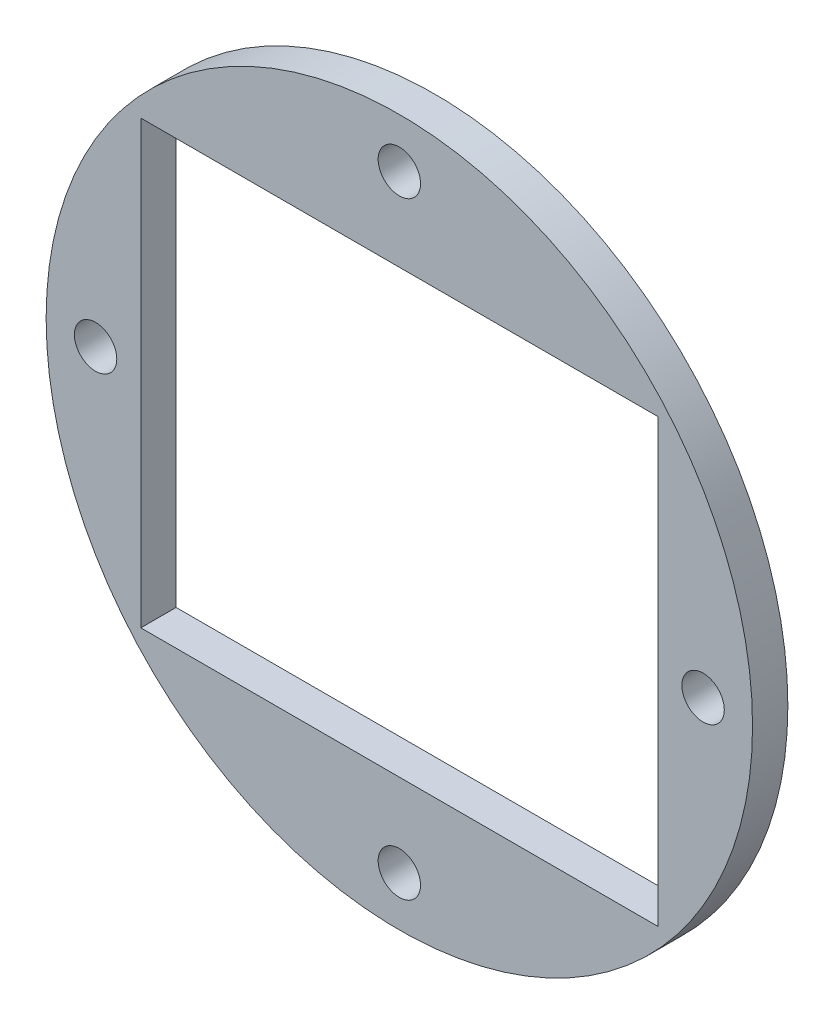
ISO-10303-21;
HEADER;
FILE_DESCRIPTION(('STEP AP214'),'2;1');
FILE_NAME('part.step','',(''),(''),'','','');
FILE_SCHEMA(('AUTOMOTIVE_DESIGN { 1 0 10303 214 1 1 1 1 }'));
ENDSEC;
DATA;
#1=APPLICATION_CONTEXT('core data for automotive mechanical design processes');
#2=APPLICATION_PROTOCOL_DEFINITION('international standard','automotive_design',2000,#1);
#3=PRODUCT_CONTEXT('',#1,'mechanical');
#4=PRODUCT('Part','Part','',(#3));
#5=PRODUCT_RELATED_PRODUCT_CATEGORY('part','',(#4));
#6=PRODUCT_DEFINITION_FORMATION('','',#4);
#7=PRODUCT_DEFINITION_CONTEXT('part definition',#1,'design');
#8=PRODUCT_DEFINITION('design','',#6,#7);
#9=PRODUCT_DEFINITION_SHAPE('','',#8);
#10=(LENGTH_UNIT() NAMED_UNIT(*) SI_UNIT(.MILLI.,.METRE.));
#11=(NAMED_UNIT(*) PLANE_ANGLE_UNIT() SI_UNIT($,.RADIAN.));
#12=(NAMED_UNIT(*) SI_UNIT($,.STERADIAN.) SOLID_ANGLE_UNIT());
#13=UNCERTAINTY_MEASURE_WITH_UNIT(LENGTH_MEASURE(1.E-05),#10,'distance_accuracy_value','');
#14=(GEOMETRIC_REPRESENTATION_CONTEXT(3) GLOBAL_UNCERTAINTY_ASSIGNED_CONTEXT((#13)) GLOBAL_UNIT_ASSIGNED_CONTEXT((#10,
#11,#12)) REPRESENTATION_CONTEXT('',''));
#15=CARTESIAN_POINT('',(0.,0.,0.));
#16=DIRECTION('',(0.,0.,1.));
#17=DIRECTION('',(1.,0.,0.));
#18=AXIS2_PLACEMENT_3D('',#15,#16,#17);
#19=CARTESIAN_POINT('',(0.,0.,5.));
#20=DIRECTION('',(0.,0.,1.));
#21=DIRECTION('',(1.,0.,0.));
#22=AXIS2_PLACEMENT_3D('',#19,#20,#21);
#23=PLANE('',#22);
#24=CARTESIAN_POINT('',(-43.,0.,5.));
#25=DIRECTION('',(0.,0.,1.));
#26=DIRECTION('',(1.,0.,0.));
#27=AXIS2_PLACEMENT_3D('',#24,#25,#26);
#28=CIRCLE('',#27,3.);
#29=CARTESIAN_POINT('',(-40.,0.,5.));
#30=VERTEX_POINT('',#29);
#31=EDGE_CURVE('E206',#30,#30,#28,.T.);
#32=ORIENTED_EDGE('',*,*,#31,.F.);
#33=EDGE_LOOP('',(#32));
#34=FACE_BOUND('',#33,.T.);
#35=CARTESIAN_POINT('',(43.,0.,5.));
#36=DIRECTION('',(0.,0.,1.));
#37=DIRECTION('',(1.,0.,0.));
#38=AXIS2_PLACEMENT_3D('',#35,#36,#37);
#39=CIRCLE('',#38,3.);
#40=CARTESIAN_POINT('',(46.,0.,5.));
#41=VERTEX_POINT('',#40);
#42=EDGE_CURVE('E102',#41,#41,#39,.T.);
#43=ORIENTED_EDGE('',*,*,#42,.F.);
#44=EDGE_LOOP('',(#43));
#45=FACE_BOUND('',#44,.T.);
#46=CARTESIAN_POINT('',(0.,0.,5.));
#47=DIRECTION('',(0.,0.,1.));
#48=DIRECTION('',(1.,0.,0.));
#49=AXIS2_PLACEMENT_3D('',#46,#47,#48);
#50=CIRCLE('',#49,50.);
#51=CARTESIAN_POINT('',(50.,0.,5.));
#52=VERTEX_POINT('',#51);
#53=EDGE_CURVE('E11',#52,#52,#50,.T.);
#54=ORIENTED_EDGE('',*,*,#53,.T.);
#55=EDGE_LOOP('',(#54));
#56=FACE_BOUND('',#55,.T.);
#57=DIRECTION('',(1.,0.,0.));
#58=VECTOR('',#57,1.);
#59=CARTESIAN_POINT('',(-36.6,-31.25,5.));
#60=LINE('',#59,#58);
#61=CARTESIAN_POINT('',(-36.6,-31.25,5.));
#62=VERTEX_POINT('',#61);
#63=CARTESIAN_POINT('',(36.6,-31.25,5.));
#64=VERTEX_POINT('',#63);
#65=EDGE_CURVE('E82',#62,#64,#60,.T.);
#66=ORIENTED_EDGE('',*,*,#65,.F.);
#67=DIRECTION('',(0.,-1.,0.));
#68=VECTOR('',#67,1.);
#69=CARTESIAN_POINT('',(-36.6,31.25,5.));
#70=LINE('',#69,#68);
#71=CARTESIAN_POINT('',(-36.6,31.25,5.));
#72=VERTEX_POINT('',#71);
#73=EDGE_CURVE('E74',#72,#62,#70,.T.);
#74=ORIENTED_EDGE('',*,*,#73,.F.);
#75=DIRECTION('',(-1.,0.,0.));
#76=VECTOR('',#75,1.);
#77=CARTESIAN_POINT('',(-36.6,31.25,5.));
#78=LINE('',#77,#76);
#79=CARTESIAN_POINT('',(36.6,31.25,5.));
#80=VERTEX_POINT('',#79);
#81=EDGE_CURVE('E96',#80,#72,#78,.T.);
#82=ORIENTED_EDGE('',*,*,#81,.F.);
#83=DIRECTION('',(0.,1.,0.));
#84=VECTOR('',#83,1.);
#85=CARTESIAN_POINT('',(36.6,31.25,5.));
#86=LINE('',#85,#84);
#87=EDGE_CURVE('E94',#64,#80,#86,.T.);
#88=ORIENTED_EDGE('',*,*,#87,.F.);
#89=EDGE_LOOP('',(#66,#74,#82,#88));
#90=FACE_BOUND('',#89,.T.);
#91=CARTESIAN_POINT('',(0.,43.,5.));
#92=DIRECTION('',(0.,0.,1.));
#93=DIRECTION('',(1.,0.,0.));
#94=AXIS2_PLACEMENT_3D('',#91,#92,#93);
#95=CIRCLE('',#94,3.);
#96=CARTESIAN_POINT('',(3.00000000000001,43.,5.));
#97=VERTEX_POINT('',#96);
#98=EDGE_CURVE('E212',#97,#97,#95,.T.);
#99=ORIENTED_EDGE('',*,*,#98,.F.);
#100=EDGE_LOOP('',(#99));
#101=FACE_BOUND('',#100,.T.);
#102=CARTESIAN_POINT('',(0.,-43.,5.));
#103=DIRECTION('',(0.,0.,1.));
#104=DIRECTION('',(1.,0.,0.));
#105=AXIS2_PLACEMENT_3D('',#102,#103,#104);
#106=CIRCLE('',#105,3.);
#107=CARTESIAN_POINT('',(3.00000000000001,-43.,5.));
#108=VERTEX_POINT('',#107);
#109=EDGE_CURVE('E197',#108,#108,#106,.T.);
#110=ORIENTED_EDGE('',*,*,#109,.F.);
#111=EDGE_LOOP('',(#110));
#112=FACE_BOUND('',#111,.T.);
#113=ADVANCED_FACE('F33',(#34,#45,#56,#90,#101,#112),#23,.T.);
#114=CARTESIAN_POINT('',(0.,0.,0.));
#115=DIRECTION('',(0.,0.,1.));
#116=DIRECTION('',(1.,0.,0.));
#117=AXIS2_PLACEMENT_3D('',#114,#115,#116);
#118=PLANE('',#117);
#119=CARTESIAN_POINT('',(0.,0.,0.));
#120=DIRECTION('',(0.,0.,1.));
#121=DIRECTION('',(1.,0.,0.));
#122=AXIS2_PLACEMENT_3D('',#119,#120,#121);
#123=CIRCLE('',#122,50.);
#124=CARTESIAN_POINT('',(50.,0.,0.));
#125=VERTEX_POINT('',#124);
#126=EDGE_CURVE('E37',#125,#125,#123,.T.);
#127=ORIENTED_EDGE('',*,*,#126,.F.);
#128=EDGE_LOOP('',(#127));
#129=FACE_BOUND('',#128,.T.);
#130=DIRECTION('',(0.,-1.,0.));
#131=VECTOR('',#130,1.);
#132=CARTESIAN_POINT('',(-36.6,31.25,0.));
#133=LINE('',#132,#131);
#134=CARTESIAN_POINT('',(-36.6,31.25,0.));
#135=VERTEX_POINT('',#134);
#136=CARTESIAN_POINT('',(-36.6,-31.25,0.));
#137=VERTEX_POINT('',#136);
#138=EDGE_CURVE('E56',#135,#137,#133,.T.);
#139=ORIENTED_EDGE('',*,*,#138,.T.);
#140=DIRECTION('',(1.,0.,0.));
#141=VECTOR('',#140,1.);
#142=CARTESIAN_POINT('',(-36.6,-31.25,0.));
#143=LINE('',#142,#141);
#144=CARTESIAN_POINT('',(36.6,-31.25,0.));
#145=VERTEX_POINT('',#144);
#146=EDGE_CURVE('E89',#137,#145,#143,.T.);
#147=ORIENTED_EDGE('',*,*,#146,.T.);
#148=DIRECTION('',(0.,1.,0.));
#149=VECTOR('',#148,1.);
#150=CARTESIAN_POINT('',(36.6,31.25,0.));
#151=LINE('',#150,#149);
#152=CARTESIAN_POINT('',(36.6,31.25,0.));
#153=VERTEX_POINT('',#152);
#154=EDGE_CURVE('E104',#145,#153,#151,.T.);
#155=ORIENTED_EDGE('',*,*,#154,.T.);
#156=DIRECTION('',(-1.,0.,0.));
#157=VECTOR('',#156,1.);
#158=CARTESIAN_POINT('',(-36.6,31.25,0.));
#159=LINE('',#158,#157);
#160=EDGE_CURVE('E83',#153,#135,#159,.T.);
#161=ORIENTED_EDGE('',*,*,#160,.T.);
#162=EDGE_LOOP('',(#139,#147,#155,#161));
#163=FACE_BOUND('',#162,.T.);
#164=CARTESIAN_POINT('',(43.,0.,0.));
#165=DIRECTION('',(0.,0.,1.));
#166=DIRECTION('',(1.,0.,0.));
#167=AXIS2_PLACEMENT_3D('',#164,#165,#166);
#168=CIRCLE('',#167,3.);
#169=CARTESIAN_POINT('',(46.,0.,0.));
#170=VERTEX_POINT('',#169);
#171=EDGE_CURVE('E215',#170,#170,#168,.T.);
#172=ORIENTED_EDGE('',*,*,#171,.T.);
#173=EDGE_LOOP('',(#172));
#174=FACE_BOUND('',#173,.T.);
#175=CARTESIAN_POINT('',(0.,43.,0.));
#176=DIRECTION('',(0.,0.,1.));
#177=DIRECTION('',(1.,0.,0.));
#178=AXIS2_PLACEMENT_3D('',#175,#176,#177);
#179=CIRCLE('',#178,3.);
#180=CARTESIAN_POINT('',(3.00000000000001,43.,0.));
#181=VERTEX_POINT('',#180);
#182=EDGE_CURVE('E209',#181,#181,#179,.T.);
#183=ORIENTED_EDGE('',*,*,#182,.T.);
#184=EDGE_LOOP('',(#183));
#185=FACE_BOUND('',#184,.T.);
#186=CARTESIAN_POINT('',(-43.,0.,0.));
#187=DIRECTION('',(0.,0.,1.));
#188=DIRECTION('',(1.,0.,0.));
#189=AXIS2_PLACEMENT_3D('',#186,#187,#188);
#190=CIRCLE('',#189,3.);
#191=CARTESIAN_POINT('',(-40.,0.,0.));
#192=VERTEX_POINT('',#191);
#193=EDGE_CURVE('E203',#192,#192,#190,.T.);
#194=ORIENTED_EDGE('',*,*,#193,.T.);
#195=EDGE_LOOP('',(#194));
#196=FACE_BOUND('',#195,.T.);
#197=CARTESIAN_POINT('',(0.,-43.,0.));
#198=DIRECTION('',(0.,0.,1.));
#199=DIRECTION('',(1.,0.,0.));
#200=AXIS2_PLACEMENT_3D('',#197,#198,#199);
#201=CIRCLE('',#200,3.);
#202=CARTESIAN_POINT('',(3.00000000000001,-43.,0.));
#203=VERTEX_POINT('',#202);
#204=EDGE_CURVE('E200',#203,#203,#201,.T.);
#205=ORIENTED_EDGE('',*,*,#204,.T.);
#206=EDGE_LOOP('',(#205));
#207=FACE_BOUND('',#206,.T.);
#208=ADVANCED_FACE('F115',(#129,#163,#174,#185,#196,#207),#118,.F.);
#209=CARTESIAN_POINT('',(0.,0.,5.));
#210=DIRECTION('',(0.,0.,-1.));
#211=DIRECTION('',(-1.,0.,0.));
#212=AXIS2_PLACEMENT_3D('',#209,#210,#211);
#213=CYLINDRICAL_SURFACE('',#212,50.);
#214=ORIENTED_EDGE('',*,*,#53,.F.);
#215=EDGE_LOOP('',(#214));
#216=FACE_BOUND('',#215,.T.);
#217=ORIENTED_EDGE('',*,*,#126,.T.);
#218=EDGE_LOOP('',(#217));
#219=FACE_BOUND('',#218,.T.);
#220=ADVANCED_FACE('F35',(#216,#219),#213,.T.);
#221=CARTESIAN_POINT('',(-36.6,31.25,5.));
#222=DIRECTION('',(1.,0.,0.));
#223=DIRECTION('',(0.,0.,-1.));
#224=AXIS2_PLACEMENT_3D('',#221,#222,#223);
#225=PLANE('',#224);
#226=ORIENTED_EDGE('',*,*,#138,.F.);
#227=DIRECTION('',(0.,0.,-1.));
#228=VECTOR('',#227,1.);
#229=CARTESIAN_POINT('',(-36.6,31.25,5.));
#230=LINE('',#229,#228);
#231=EDGE_CURVE('E78',#72,#135,#230,.T.);
#232=ORIENTED_EDGE('',*,*,#231,.F.);
#233=ORIENTED_EDGE('',*,*,#73,.T.);
#234=DIRECTION('',(0.,0.,-1.));
#235=VECTOR('',#234,1.);
#236=CARTESIAN_POINT('',(-36.6,-31.25,5.));
#237=LINE('',#236,#235);
#238=EDGE_CURVE('E77',#62,#137,#237,.T.);
#239=ORIENTED_EDGE('',*,*,#238,.T.);
#240=EDGE_LOOP('',(#226,#232,#233,#239));
#241=FACE_BOUND('',#240,.T.);
#242=ADVANCED_FACE('F76',(#241),#225,.T.);
#243=CARTESIAN_POINT('',(-36.6,-31.25,5.));
#244=DIRECTION('',(0.,1.,0.));
#245=DIRECTION('',(0.,0.,1.));
#246=AXIS2_PLACEMENT_3D('',#243,#244,#245);
#247=PLANE('',#246);
#248=ORIENTED_EDGE('',*,*,#146,.F.);
#249=ORIENTED_EDGE('',*,*,#238,.F.);
#250=ORIENTED_EDGE('',*,*,#65,.T.);
#251=DIRECTION('',(0.,0.,-1.));
#252=VECTOR('',#251,1.);
#253=CARTESIAN_POINT('',(36.6,-31.25,5.));
#254=LINE('',#253,#252);
#255=EDGE_CURVE('E90',#64,#145,#254,.T.);
#256=ORIENTED_EDGE('',*,*,#255,.T.);
#257=EDGE_LOOP('',(#248,#249,#250,#256));
#258=FACE_BOUND('',#257,.T.);
#259=ADVANCED_FACE('F86',(#258),#247,.T.);
#260=CARTESIAN_POINT('',(36.6,31.25,5.));
#261=DIRECTION('',(-1.,0.,0.));
#262=DIRECTION('',(0.,-1.,0.));
#263=AXIS2_PLACEMENT_3D('',#260,#261,#262);
#264=PLANE('',#263);
#265=ORIENTED_EDGE('',*,*,#154,.F.);
#266=ORIENTED_EDGE('',*,*,#255,.F.);
#267=ORIENTED_EDGE('',*,*,#87,.T.);
#268=DIRECTION('',(0.,0.,-1.));
#269=VECTOR('',#268,1.);
#270=CARTESIAN_POINT('',(36.6,31.25,5.));
#271=LINE('',#270,#269);
#272=EDGE_CURVE('E48',#80,#153,#271,.T.);
#273=ORIENTED_EDGE('',*,*,#272,.T.);
#274=EDGE_LOOP('',(#265,#266,#267,#273));
#275=FACE_BOUND('',#274,.T.);
#276=ADVANCED_FACE('F113',(#275),#264,.T.);
#277=CARTESIAN_POINT('',(-36.6,31.25,5.));
#278=DIRECTION('',(0.,-1.,0.));
#279=DIRECTION('',(0.,0.,-1.));
#280=AXIS2_PLACEMENT_3D('',#277,#278,#279);
#281=PLANE('',#280);
#282=ORIENTED_EDGE('',*,*,#160,.F.);
#283=ORIENTED_EDGE('',*,*,#272,.F.);
#284=ORIENTED_EDGE('',*,*,#81,.T.);
#285=ORIENTED_EDGE('',*,*,#231,.T.);
#286=EDGE_LOOP('',(#282,#283,#284,#285));
#287=FACE_BOUND('',#286,.T.);
#288=ADVANCED_FACE('F117',(#287),#281,.T.);
#289=CARTESIAN_POINT('',(43.,0.,5.));
#290=DIRECTION('',(0.,0.,-1.));
#291=DIRECTION('',(-1.,0.,0.));
#292=AXIS2_PLACEMENT_3D('',#289,#290,#291);
#293=CYLINDRICAL_SURFACE('',#292,3.);
#294=ORIENTED_EDGE('',*,*,#42,.T.);
#295=EDGE_LOOP('',(#294));
#296=FACE_BOUND('',#295,.T.);
#297=ORIENTED_EDGE('',*,*,#171,.F.);
#298=EDGE_LOOP('',(#297));
#299=FACE_BOUND('',#298,.T.);
#300=ADVANCED_FACE('F119',(#296,#299),#293,.F.);
#301=CARTESIAN_POINT('',(0.,43.,5.));
#302=DIRECTION('',(0.,0.,-1.));
#303=DIRECTION('',(-1.,0.,0.));
#304=AXIS2_PLACEMENT_3D('',#301,#302,#303);
#305=CYLINDRICAL_SURFACE('',#304,3.);
#306=ORIENTED_EDGE('',*,*,#98,.T.);
#307=EDGE_LOOP('',(#306));
#308=FACE_BOUND('',#307,.T.);
#309=ORIENTED_EDGE('',*,*,#182,.F.);
#310=EDGE_LOOP('',(#309));
#311=FACE_BOUND('',#310,.T.);
#312=ADVANCED_FACE('F125',(#308,#311),#305,.F.);
#313=CARTESIAN_POINT('',(-43.,0.,5.));
#314=DIRECTION('',(0.,0.,-1.));
#315=DIRECTION('',(-1.,0.,0.));
#316=AXIS2_PLACEMENT_3D('',#313,#314,#315);
#317=CYLINDRICAL_SURFACE('',#316,3.);
#318=ORIENTED_EDGE('',*,*,#31,.T.);
#319=EDGE_LOOP('',(#318));
#320=FACE_BOUND('',#319,.T.);
#321=ORIENTED_EDGE('',*,*,#193,.F.);
#322=EDGE_LOOP('',(#321));
#323=FACE_BOUND('',#322,.T.);
#324=ADVANCED_FACE('F170',(#320,#323),#317,.F.);
#325=CARTESIAN_POINT('',(0.,-43.,5.));
#326=DIRECTION('',(0.,0.,-1.));
#327=DIRECTION('',(-1.,0.,0.));
#328=AXIS2_PLACEMENT_3D('',#325,#326,#327);
#329=CYLINDRICAL_SURFACE('',#328,3.);
#330=ORIENTED_EDGE('',*,*,#109,.T.);
#331=EDGE_LOOP('',(#330));
#332=FACE_BOUND('',#331,.T.);
#333=ORIENTED_EDGE('',*,*,#204,.F.);
#334=EDGE_LOOP('',(#333));
#335=FACE_BOUND('',#334,.T.);
#336=ADVANCED_FACE('F180',(#332,#335),#329,.F.);
#337=CLOSED_SHELL('',(#113,#208,#220,#242,#259,#276,#288,#300,#312,#324,#336));
#338=MANIFOLD_SOLID_BREP('B2',#337);
#339=ADVANCED_BREP_SHAPE_REPRESENTATION('',(#18,#338),#14);
#340=SHAPE_DEFINITION_REPRESENTATION(#9,#339);
ENDSEC;
END-ISO-10303-21;
